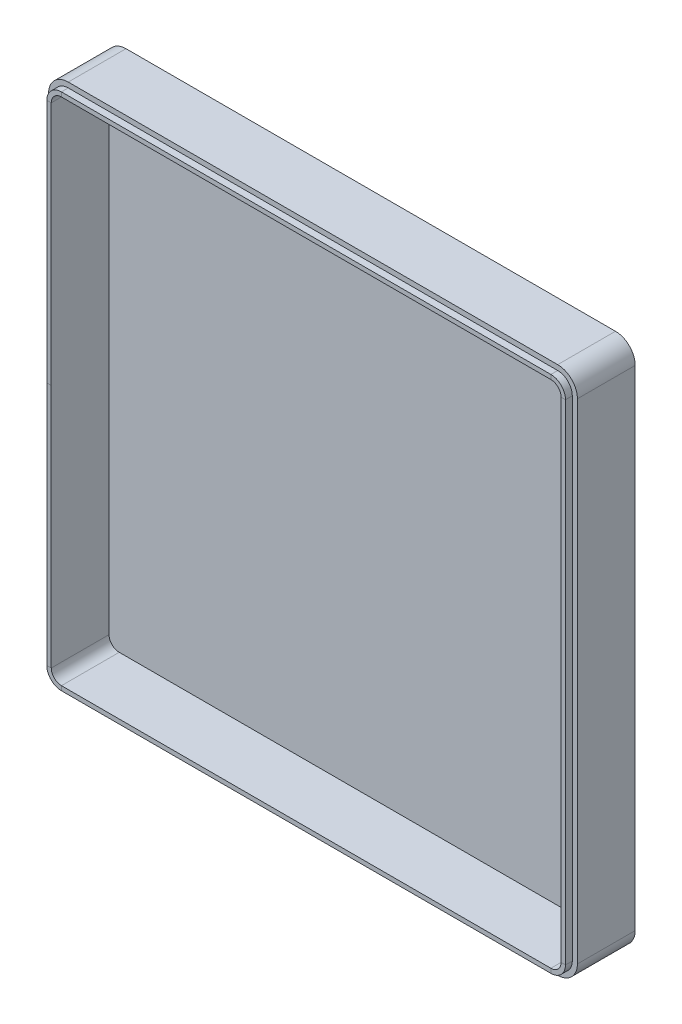
ISO-10303-21;
HEADER;
FILE_DESCRIPTION(('STEP AP214'),'2;1');
FILE_NAME('part.step','',(''),(''),'','','');
FILE_SCHEMA(('AUTOMOTIVE_DESIGN { 1 0 10303 214 1 1 1 1 }'));
ENDSEC;
DATA;
#1=APPLICATION_CONTEXT('core data for automotive mechanical design processes');
#2=APPLICATION_PROTOCOL_DEFINITION('international standard','automotive_design',2000,#1);
#3=PRODUCT_CONTEXT('',#1,'mechanical');
#4=PRODUCT('Part','Part','',(#3));
#5=PRODUCT_RELATED_PRODUCT_CATEGORY('part','',(#4));
#6=PRODUCT_DEFINITION_FORMATION('','',#4);
#7=PRODUCT_DEFINITION_CONTEXT('part definition',#1,'design');
#8=PRODUCT_DEFINITION('design','',#6,#7);
#9=PRODUCT_DEFINITION_SHAPE('','',#8);
#10=(LENGTH_UNIT() NAMED_UNIT(*) SI_UNIT(.MILLI.,.METRE.));
#11=(NAMED_UNIT(*) PLANE_ANGLE_UNIT() SI_UNIT($,.RADIAN.));
#12=(NAMED_UNIT(*) SI_UNIT($,.STERADIAN.) SOLID_ANGLE_UNIT());
#13=UNCERTAINTY_MEASURE_WITH_UNIT(LENGTH_MEASURE(1.E-05),#10,'distance_accuracy_value','');
#14=(GEOMETRIC_REPRESENTATION_CONTEXT(3) GLOBAL_UNCERTAINTY_ASSIGNED_CONTEXT((#13)) GLOBAL_UNIT_ASSIGNED_CONTEXT((#10,
#11,#12)) REPRESENTATION_CONTEXT('',''));
#15=CARTESIAN_POINT('',(0.,0.,0.));
#16=DIRECTION('',(0.,0.,1.));
#17=DIRECTION('',(1.,0.,0.));
#18=AXIS2_PLACEMENT_3D('',#15,#16,#17);
#19=CARTESIAN_POINT('',(-75.,77.8,0.));
#20=DIRECTION('',(0.,1.,0.));
#21=DIRECTION('',(0.,0.,1.));
#22=AXIS2_PLACEMENT_3D('',#19,#20,#21);
#23=PLANE('',#22);
#24=DIRECTION('',(0.,0.,1.));
#25=VECTOR('',#24,1.);
#26=CARTESIAN_POINT('',(72.,77.8,0.));
#27=LINE('',#26,#25);
#28=CARTESIAN_POINT('',(72.,77.8,15.));
#29=VERTEX_POINT('',#28);
#30=CARTESIAN_POINT('',(72.,77.8,-2.));
#31=VERTEX_POINT('',#30);
#32=EDGE_CURVE('E222',#29,#31,#27,.F.);
#33=ORIENTED_EDGE('',*,*,#32,.T.);
#34=DIRECTION('',(1.,0.,0.));
#35=VECTOR('',#34,1.);
#36=CARTESIAN_POINT('',(-72.,77.8,-2.));
#37=LINE('',#36,#35);
#38=CARTESIAN_POINT('',(-72.,77.8,-2.));
#39=VERTEX_POINT('',#38);
#40=EDGE_CURVE('E51',#39,#31,#37,.T.);
#41=ORIENTED_EDGE('',*,*,#40,.F.);
#42=DIRECTION('',(0.,0.,1.));
#43=VECTOR('',#42,1.);
#44=CARTESIAN_POINT('',(-72.,77.8,0.));
#45=LINE('',#44,#43);
#46=CARTESIAN_POINT('',(-72.,77.8,15.));
#47=VERTEX_POINT('',#46);
#48=EDGE_CURVE('E219',#39,#47,#45,.T.);
#49=ORIENTED_EDGE('',*,*,#48,.T.);
#50=DIRECTION('',(1.,0.,0.));
#51=VECTOR('',#50,1.);
#52=CARTESIAN_POINT('',(-75.,77.8,15.));
#53=LINE('',#52,#51);
#54=EDGE_CURVE('E265',#47,#29,#53,.T.);
#55=ORIENTED_EDGE('',*,*,#54,.T.);
#56=EDGE_LOOP('',(#33,#41,#49,#55));
#57=FACE_BOUND('',#56,.T.);
#58=ADVANCED_FACE('F34',(#57),#23,.T.);
#59=CARTESIAN_POINT('',(-77.8,75.,0.));
#60=DIRECTION('',(-1.,0.,0.));
#61=DIRECTION('',(0.,0.,1.));
#62=AXIS2_PLACEMENT_3D('',#59,#60,#61);
#63=PLANE('',#62);
#64=DIRECTION('',(0.,0.,1.));
#65=VECTOR('',#64,1.);
#66=CARTESIAN_POINT('',(-77.8,72.,0.));
#67=LINE('',#66,#65);
#68=CARTESIAN_POINT('',(-77.8,72.,15.));
#69=VERTEX_POINT('',#68);
#70=CARTESIAN_POINT('',(-77.8,72.,-2.));
#71=VERTEX_POINT('',#70);
#72=EDGE_CURVE('E236',#69,#71,#67,.F.);
#73=ORIENTED_EDGE('',*,*,#72,.T.);
#74=DIRECTION('',(0.,1.,0.));
#75=VECTOR('',#74,1.);
#76=CARTESIAN_POINT('',(-77.8,-72.,-2.));
#77=LINE('',#76,#75);
#78=CARTESIAN_POINT('',(-77.8,-72.,-2.));
#79=VERTEX_POINT('',#78);
#80=EDGE_CURVE('E210',#79,#71,#77,.T.);
#81=ORIENTED_EDGE('',*,*,#80,.F.);
#82=DIRECTION('',(0.,0.,1.));
#83=VECTOR('',#82,1.);
#84=CARTESIAN_POINT('',(-77.8,-72.,0.));
#85=LINE('',#84,#83);
#86=CARTESIAN_POINT('',(-77.8,-72.,15.));
#87=VERTEX_POINT('',#86);
#88=EDGE_CURVE('E238',#79,#87,#85,.T.);
#89=ORIENTED_EDGE('',*,*,#88,.T.);
#90=DIRECTION('',(0.,1.,0.));
#91=VECTOR('',#90,1.);
#92=CARTESIAN_POINT('',(-77.8,75.,15.));
#93=LINE('',#92,#91);
#94=EDGE_CURVE('E261',#87,#69,#93,.T.);
#95=ORIENTED_EDGE('',*,*,#94,.T.);
#96=EDGE_LOOP('',(#73,#81,#89,#95));
#97=FACE_BOUND('',#96,.T.);
#98=ADVANCED_FACE('F452',(#97),#63,.T.);
#99=CARTESIAN_POINT('',(-72.,72.,0.));
#100=DIRECTION('',(0.,0.,1.));
#101=DIRECTION('',(1.,0.,0.));
#102=AXIS2_PLACEMENT_3D('',#99,#100,#101);
#103=CYLINDRICAL_SURFACE('',#102,5.8);
#104=ORIENTED_EDGE('',*,*,#48,.F.);
#105=CARTESIAN_POINT('',(-72.,72.,-2.));
#106=DIRECTION('',(0.,0.,-1.));
#107=DIRECTION('',(-1.,0.,0.));
#108=AXIS2_PLACEMENT_3D('',#105,#106,#107);
#109=CIRCLE('',#108,5.8);
#110=EDGE_CURVE('E207',#71,#39,#109,.T.);
#111=ORIENTED_EDGE('',*,*,#110,.F.);
#112=ORIENTED_EDGE('',*,*,#72,.F.);
#113=CARTESIAN_POINT('',(-72.,72.,15.));
#114=DIRECTION('',(0.,0.,1.));
#115=DIRECTION('',(1.,0.,0.));
#116=AXIS2_PLACEMENT_3D('',#113,#114,#115);
#117=CIRCLE('',#116,5.8);
#118=EDGE_CURVE('E225',#69,#47,#117,.F.);
#119=ORIENTED_EDGE('',*,*,#118,.T.);
#120=EDGE_LOOP('',(#104,#111,#112,#119));
#121=FACE_BOUND('',#120,.T.);
#122=ADVANCED_FACE('F36',(#121),#103,.T.);
#123=CARTESIAN_POINT('',(-75.,-77.8,0.));
#124=DIRECTION('',(0.,-1.,0.));
#125=DIRECTION('',(0.,0.,-1.));
#126=AXIS2_PLACEMENT_3D('',#123,#124,#125);
#127=PLANE('',#126);
#128=DIRECTION('',(0.,0.,1.));
#129=VECTOR('',#128,1.);
#130=CARTESIAN_POINT('',(-72.,-77.8,0.));
#131=LINE('',#130,#129);
#132=CARTESIAN_POINT('',(-72.,-77.8,15.));
#133=VERTEX_POINT('',#132);
#134=CARTESIAN_POINT('',(-72.,-77.8,-2.));
#135=VERTEX_POINT('',#134);
#136=EDGE_CURVE('E229',#133,#135,#131,.F.);
#137=ORIENTED_EDGE('',*,*,#136,.T.);
#138=DIRECTION('',(-1.,0.,0.));
#139=VECTOR('',#138,1.);
#140=CARTESIAN_POINT('',(72.,-77.8,-2.));
#141=LINE('',#140,#139);
#142=CARTESIAN_POINT('',(72.,-77.8,-2.));
#143=VERTEX_POINT('',#142);
#144=EDGE_CURVE('E420',#143,#135,#141,.T.);
#145=ORIENTED_EDGE('',*,*,#144,.F.);
#146=DIRECTION('',(0.,0.,1.));
#147=VECTOR('',#146,1.);
#148=CARTESIAN_POINT('',(72.,-77.8,0.));
#149=LINE('',#148,#147);
#150=CARTESIAN_POINT('',(72.,-77.8,15.));
#151=VERTEX_POINT('',#150);
#152=EDGE_CURVE('E234',#143,#151,#149,.T.);
#153=ORIENTED_EDGE('',*,*,#152,.T.);
#154=DIRECTION('',(-1.,0.,0.));
#155=VECTOR('',#154,1.);
#156=CARTESIAN_POINT('',(-75.,-77.8,15.));
#157=LINE('',#156,#155);
#158=EDGE_CURVE('E258',#151,#133,#157,.T.);
#159=ORIENTED_EDGE('',*,*,#158,.T.);
#160=EDGE_LOOP('',(#137,#145,#153,#159));
#161=FACE_BOUND('',#160,.T.);
#162=ADVANCED_FACE('F445',(#161),#127,.T.);
#163=CARTESIAN_POINT('',(-72.,-72.,0.));
#164=DIRECTION('',(0.,0.,1.));
#165=DIRECTION('',(1.,0.,0.));
#166=AXIS2_PLACEMENT_3D('',#163,#164,#165);
#167=CYLINDRICAL_SURFACE('',#166,5.8);
#168=ORIENTED_EDGE('',*,*,#88,.F.);
#169=CARTESIAN_POINT('',(-72.,-72.,-2.));
#170=DIRECTION('',(0.,0.,-1.));
#171=DIRECTION('',(-1.,0.,0.));
#172=AXIS2_PLACEMENT_3D('',#169,#170,#171);
#173=CIRCLE('',#172,5.8);
#174=EDGE_CURVE('E418',#135,#79,#173,.T.);
#175=ORIENTED_EDGE('',*,*,#174,.F.);
#176=ORIENTED_EDGE('',*,*,#136,.F.);
#177=CARTESIAN_POINT('',(-72.,-72.,15.));
#178=DIRECTION('',(0.,0.,1.));
#179=DIRECTION('',(1.,0.,0.));
#180=AXIS2_PLACEMENT_3D('',#177,#178,#179);
#181=CIRCLE('',#180,5.8);
#182=EDGE_CURVE('E276',#133,#87,#181,.F.);
#183=ORIENTED_EDGE('',*,*,#182,.T.);
#184=EDGE_LOOP('',(#168,#175,#176,#183));
#185=FACE_BOUND('',#184,.T.);
#186=ADVANCED_FACE('F449',(#185),#167,.T.);
#187=CARTESIAN_POINT('',(77.8,75.,0.));
#188=DIRECTION('',(1.,0.,0.));
#189=DIRECTION('',(0.,1.,0.));
#190=AXIS2_PLACEMENT_3D('',#187,#188,#189);
#191=PLANE('',#190);
#192=DIRECTION('',(0.,0.,1.));
#193=VECTOR('',#192,1.);
#194=CARTESIAN_POINT('',(77.8,-72.,0.));
#195=LINE('',#194,#193);
#196=CARTESIAN_POINT('',(77.8,-72.,15.));
#197=VERTEX_POINT('',#196);
#198=CARTESIAN_POINT('',(77.8,-72.,-2.));
#199=VERTEX_POINT('',#198);
#200=EDGE_CURVE('E38',#197,#199,#195,.F.);
#201=ORIENTED_EDGE('',*,*,#200,.T.);
#202=DIRECTION('',(0.,-1.,0.));
#203=VECTOR('',#202,1.);
#204=CARTESIAN_POINT('',(77.8,72.,-2.));
#205=LINE('',#204,#203);
#206=CARTESIAN_POINT('',(77.8,72.,-2.));
#207=VERTEX_POINT('',#206);
#208=EDGE_CURVE('E424',#207,#199,#205,.T.);
#209=ORIENTED_EDGE('',*,*,#208,.F.);
#210=DIRECTION('',(0.,0.,1.));
#211=VECTOR('',#210,1.);
#212=CARTESIAN_POINT('',(77.8,72.,0.));
#213=LINE('',#212,#211);
#214=CARTESIAN_POINT('',(77.8,72.,15.));
#215=VERTEX_POINT('',#214);
#216=EDGE_CURVE('E227',#207,#215,#213,.T.);
#217=ORIENTED_EDGE('',*,*,#216,.T.);
#218=DIRECTION('',(0.,-1.,0.));
#219=VECTOR('',#218,1.);
#220=CARTESIAN_POINT('',(77.8,75.,15.));
#221=LINE('',#220,#219);
#222=EDGE_CURVE('E267',#215,#197,#221,.T.);
#223=ORIENTED_EDGE('',*,*,#222,.T.);
#224=EDGE_LOOP('',(#201,#209,#217,#223));
#225=FACE_BOUND('',#224,.T.);
#226=ADVANCED_FACE('F432',(#225),#191,.T.);
#227=CARTESIAN_POINT('',(72.,-72.,0.));
#228=DIRECTION('',(0.,0.,1.));
#229=DIRECTION('',(1.,0.,0.));
#230=AXIS2_PLACEMENT_3D('',#227,#228,#229);
#231=CYLINDRICAL_SURFACE('',#230,5.8);
#232=ORIENTED_EDGE('',*,*,#152,.F.);
#233=CARTESIAN_POINT('',(72.,-72.,-2.));
#234=DIRECTION('',(0.,0.,-1.));
#235=DIRECTION('',(-1.,0.,0.));
#236=AXIS2_PLACEMENT_3D('',#233,#234,#235);
#237=CIRCLE('',#236,5.8);
#238=EDGE_CURVE('E422',#199,#143,#237,.T.);
#239=ORIENTED_EDGE('',*,*,#238,.F.);
#240=ORIENTED_EDGE('',*,*,#200,.F.);
#241=CARTESIAN_POINT('',(72.,-72.,15.));
#242=DIRECTION('',(0.,0.,1.));
#243=DIRECTION('',(1.,0.,0.));
#244=AXIS2_PLACEMENT_3D('',#241,#242,#243);
#245=CIRCLE('',#244,5.8);
#246=EDGE_CURVE('E273',#197,#151,#245,.F.);
#247=ORIENTED_EDGE('',*,*,#246,.T.);
#248=EDGE_LOOP('',(#232,#239,#240,#247));
#249=FACE_BOUND('',#248,.T.);
#250=ADVANCED_FACE('F441',(#249),#231,.T.);
#251=CARTESIAN_POINT('',(72.,72.,0.));
#252=DIRECTION('',(0.,0.,1.));
#253=DIRECTION('',(1.,0.,0.));
#254=AXIS2_PLACEMENT_3D('',#251,#252,#253);
#255=CYLINDRICAL_SURFACE('',#254,5.8);
#256=ORIENTED_EDGE('',*,*,#216,.F.);
#257=CARTESIAN_POINT('',(72.,72.,-2.));
#258=DIRECTION('',(0.,0.,-1.));
#259=DIRECTION('',(-1.,0.,0.));
#260=AXIS2_PLACEMENT_3D('',#257,#258,#259);
#261=CIRCLE('',#260,5.8);
#262=EDGE_CURVE('E223',#31,#207,#261,.T.);
#263=ORIENTED_EDGE('',*,*,#262,.F.);
#264=ORIENTED_EDGE('',*,*,#32,.F.);
#265=CARTESIAN_POINT('',(72.,72.,15.));
#266=DIRECTION('',(0.,0.,1.));
#267=DIRECTION('',(1.,0.,0.));
#268=AXIS2_PLACEMENT_3D('',#265,#266,#267);
#269=CIRCLE('',#268,5.8);
#270=EDGE_CURVE('E270',#29,#215,#269,.F.);
#271=ORIENTED_EDGE('',*,*,#270,.T.);
#272=EDGE_LOOP('',(#256,#263,#264,#271));
#273=FACE_BOUND('',#272,.T.);
#274=ADVANCED_FACE('F434',(#273),#255,.T.);
#275=CARTESIAN_POINT('',(0.,0.,15.));
#276=DIRECTION('',(0.,0.,1.));
#277=DIRECTION('',(1.,0.,0.));
#278=AXIS2_PLACEMENT_3D('',#275,#276,#277);
#279=PLANE('',#278);
#280=DIRECTION('',(0.,1.,0.));
#281=VECTOR('',#280,1.);
#282=CARTESIAN_POINT('',(-76.3,-72.,15.));
#283=LINE('',#282,#281);
#284=CARTESIAN_POINT('',(-76.3,-72.,15.));
#285=VERTEX_POINT('',#284);
#286=CARTESIAN_POINT('',(-76.3,0.,15.));
#287=VERTEX_POINT('',#286);
#288=EDGE_CURVE('E340',#285,#287,#283,.T.);
#289=ORIENTED_EDGE('',*,*,#288,.T.);
#290=DIRECTION('',(0.,1.,0.));
#291=VECTOR('',#290,1.);
#292=CARTESIAN_POINT('',(-76.3,0.,15.));
#293=LINE('',#292,#291);
#294=CARTESIAN_POINT('',(-76.3,72.,15.));
#295=VERTEX_POINT('',#294);
#296=EDGE_CURVE('E386',#287,#295,#293,.T.);
#297=ORIENTED_EDGE('',*,*,#296,.T.);
#298=CARTESIAN_POINT('',(-72.,72.,15.));
#299=DIRECTION('',(0.,0.,-1.));
#300=DIRECTION('',(-1.,0.,0.));
#301=AXIS2_PLACEMENT_3D('',#298,#299,#300);
#302=CIRCLE('',#301,4.3);
#303=CARTESIAN_POINT('',(-72.,76.3,15.));
#304=VERTEX_POINT('',#303);
#305=EDGE_CURVE('E380',#295,#304,#302,.T.);
#306=ORIENTED_EDGE('',*,*,#305,.T.);
#307=DIRECTION('',(1.,0.,0.));
#308=VECTOR('',#307,1.);
#309=CARTESIAN_POINT('',(-72.,76.3,15.));
#310=LINE('',#309,#308);
#311=CARTESIAN_POINT('',(72.,76.3,15.));
#312=VERTEX_POINT('',#311);
#313=EDGE_CURVE('E374',#304,#312,#310,.T.);
#314=ORIENTED_EDGE('',*,*,#313,.T.);
#315=CARTESIAN_POINT('',(72.,72.,15.));
#316=DIRECTION('',(0.,0.,-1.));
#317=DIRECTION('',(0.,1.,0.));
#318=AXIS2_PLACEMENT_3D('',#315,#316,#317);
#319=CIRCLE('',#318,4.3);
#320=CARTESIAN_POINT('',(76.3,72.,15.));
#321=VERTEX_POINT('',#320);
#322=EDGE_CURVE('E368',#312,#321,#319,.T.);
#323=ORIENTED_EDGE('',*,*,#322,.T.);
#324=DIRECTION('',(0.,-1.,0.));
#325=VECTOR('',#324,1.);
#326=CARTESIAN_POINT('',(76.3,72.,15.));
#327=LINE('',#326,#325);
#328=CARTESIAN_POINT('',(76.3,-72.,15.));
#329=VERTEX_POINT('',#328);
#330=EDGE_CURVE('E360',#321,#329,#327,.T.);
#331=ORIENTED_EDGE('',*,*,#330,.T.);
#332=CARTESIAN_POINT('',(72.,-72.,15.));
#333=DIRECTION('',(0.,0.,-1.));
#334=DIRECTION('',(1.,0.,0.));
#335=AXIS2_PLACEMENT_3D('',#332,#333,#334);
#336=CIRCLE('',#335,4.3);
#337=CARTESIAN_POINT('',(72.,-76.3,15.));
#338=VERTEX_POINT('',#337);
#339=EDGE_CURVE('E357',#329,#338,#336,.T.);
#340=ORIENTED_EDGE('',*,*,#339,.T.);
#341=DIRECTION('',(-1.,0.,0.));
#342=VECTOR('',#341,1.);
#343=CARTESIAN_POINT('',(72.,-76.3,15.));
#344=LINE('',#343,#342);
#345=CARTESIAN_POINT('',(-72.,-76.3,15.));
#346=VERTEX_POINT('',#345);
#347=EDGE_CURVE('E351',#338,#346,#344,.T.);
#348=ORIENTED_EDGE('',*,*,#347,.T.);
#349=CARTESIAN_POINT('',(-72.,-72.,15.));
#350=DIRECTION('',(0.,0.,-1.));
#351=DIRECTION('',(0.,-1.,0.));
#352=AXIS2_PLACEMENT_3D('',#349,#350,#351);
#353=CIRCLE('',#352,4.3);
#354=EDGE_CURVE('E59',#346,#285,#353,.T.);
#355=ORIENTED_EDGE('',*,*,#354,.T.);
#356=EDGE_LOOP('',(#289,#297,#306,#314,#323,#331,#340,#348,#355));
#357=FACE_BOUND('',#356,.T.);
#358=ORIENTED_EDGE('',*,*,#246,.F.);
#359=ORIENTED_EDGE('',*,*,#222,.F.);
#360=ORIENTED_EDGE('',*,*,#270,.F.);
#361=ORIENTED_EDGE('',*,*,#54,.F.);
#362=ORIENTED_EDGE('',*,*,#118,.F.);
#363=ORIENTED_EDGE('',*,*,#94,.F.);
#364=ORIENTED_EDGE('',*,*,#182,.F.);
#365=ORIENTED_EDGE('',*,*,#158,.F.);
#366=EDGE_LOOP('',(#358,#359,#360,#361,#362,#363,#364,#365));
#367=FACE_BOUND('',#366,.T.);
#368=ADVANCED_FACE('F437',(#357,#367),#279,.T.);
#369=CARTESIAN_POINT('',(-76.3,-72.,17.));
#370=DIRECTION('',(0.,0.,1.));
#371=DIRECTION('',(1.,0.,0.));
#372=AXIS2_PLACEMENT_3D('',#369,#370,#371);
#373=PLANE('',#372);
#374=DIRECTION('',(0.,1.,0.));
#375=VECTOR('',#374,1.);
#376=CARTESIAN_POINT('',(-76.3,-72.,17.));
#377=LINE('',#376,#375);
#378=CARTESIAN_POINT('',(-76.3,-72.,17.));
#379=VERTEX_POINT('',#378);
#380=CARTESIAN_POINT('',(-76.3,0.,17.));
#381=VERTEX_POINT('',#380);
#382=EDGE_CURVE('E262',#379,#381,#377,.T.);
#383=ORIENTED_EDGE('',*,*,#382,.F.);
#384=DIRECTION('',(1.,0.,0.));
#385=VECTOR('',#384,1.);
#386=CARTESIAN_POINT('',(-76.3,-72.,17.));
#387=LINE('',#386,#385);
#388=CARTESIAN_POINT('',(-75.,-72.,17.));
#389=VERTEX_POINT('',#388);
#390=EDGE_CURVE('E294',#379,#389,#387,.T.);
#391=ORIENTED_EDGE('',*,*,#390,.T.);
#392=DIRECTION('',(0.,1.,0.));
#393=VECTOR('',#392,1.);
#394=CARTESIAN_POINT('',(-75.,-72.,17.));
#395=LINE('',#394,#393);
#396=CARTESIAN_POINT('',(-75.,0.,17.));
#397=VERTEX_POINT('',#396);
#398=EDGE_CURVE('E297',#389,#397,#395,.T.);
#399=ORIENTED_EDGE('',*,*,#398,.T.);
#400=DIRECTION('',(1.,0.,0.));
#401=VECTOR('',#400,1.);
#402=CARTESIAN_POINT('',(-76.3,0.,17.));
#403=LINE('',#402,#401);
#404=EDGE_CURVE('E334',#381,#397,#403,.T.);
#405=ORIENTED_EDGE('',*,*,#404,.F.);
#406=EDGE_LOOP('',(#383,#391,#399,#405));
#407=FACE_BOUND('',#406,.T.);
#408=ADVANCED_FACE('F496',(#407),#373,.T.);
#409=CARTESIAN_POINT('',(-76.3,-72.,17.));
#410=DIRECTION('',(-1.,0.,0.));
#411=DIRECTION('',(0.,0.,1.));
#412=AXIS2_PLACEMENT_3D('',#409,#410,#411);
#413=PLANE('',#412);
#414=ORIENTED_EDGE('',*,*,#288,.F.);
#415=DIRECTION('',(0.,0.,1.));
#416=VECTOR('',#415,1.);
#417=CARTESIAN_POINT('',(-76.3,-72.,17.));
#418=LINE('',#417,#416);
#419=EDGE_CURVE('E343',#285,#379,#418,.T.);
#420=ORIENTED_EDGE('',*,*,#419,.T.);
#421=ORIENTED_EDGE('',*,*,#382,.T.);
#422=DIRECTION('',(0.,0.,1.));
#423=VECTOR('',#422,1.);
#424=CARTESIAN_POINT('',(-76.3,0.,17.));
#425=LINE('',#424,#423);
#426=EDGE_CURVE('E338',#287,#381,#425,.T.);
#427=ORIENTED_EDGE('',*,*,#426,.F.);
#428=EDGE_LOOP('',(#414,#420,#421,#427));
#429=FACE_BOUND('',#428,.T.);
#430=ADVANCED_FACE('F504',(#429),#413,.T.);
#431=CARTESIAN_POINT('',(-72.,-76.3,17.));
#432=DIRECTION('',(0.,0.,1.));
#433=DIRECTION('',(1.,0.,0.));
#434=AXIS2_PLACEMENT_3D('',#431,#432,#433);
#435=PLANE('',#434);
#436=ORIENTED_EDGE('',*,*,#390,.F.);
#437=CARTESIAN_POINT('',(-72.,-72.,17.));
#438=DIRECTION('',(0.,0.,-1.));
#439=DIRECTION('',(0.,-1.,0.));
#440=AXIS2_PLACEMENT_3D('',#437,#438,#439);
#441=CIRCLE('',#440,4.3);
#442=CARTESIAN_POINT('',(-72.,-76.3,17.));
#443=VERTEX_POINT('',#442);
#444=EDGE_CURVE('E298',#443,#379,#441,.T.);
#445=ORIENTED_EDGE('',*,*,#444,.F.);
#446=DIRECTION('',(0.,1.,0.));
#447=VECTOR('',#446,1.);
#448=CARTESIAN_POINT('',(-72.,-76.3,17.));
#449=LINE('',#448,#447);
#450=CARTESIAN_POINT('',(-72.,-75.,17.));
#451=VERTEX_POINT('',#450);
#452=EDGE_CURVE('E299',#443,#451,#449,.T.);
#453=ORIENTED_EDGE('',*,*,#452,.T.);
#454=CARTESIAN_POINT('',(-72.,-72.,17.));
#455=DIRECTION('',(0.,0.,-1.));
#456=DIRECTION('',(0.,-1.,0.));
#457=AXIS2_PLACEMENT_3D('',#454,#455,#456);
#458=CIRCLE('',#457,3.);
#459=EDGE_CURVE('E302',#451,#389,#458,.T.);
#460=ORIENTED_EDGE('',*,*,#459,.T.);
#461=EDGE_LOOP('',(#436,#445,#453,#460));
#462=FACE_BOUND('',#461,.T.);
#463=ADVANCED_FACE('F512',(#462),#435,.T.);
#464=CARTESIAN_POINT('',(-72.,-72.,15.));
#465=DIRECTION('',(0.,0.,-1.));
#466=DIRECTION('',(-1.,0.,0.));
#467=AXIS2_PLACEMENT_3D('',#464,#465,#466);
#468=CYLINDRICAL_SURFACE('',#467,4.3);
#469=ORIENTED_EDGE('',*,*,#444,.T.);
#470=ORIENTED_EDGE('',*,*,#419,.F.);
#471=ORIENTED_EDGE('',*,*,#354,.F.);
#472=DIRECTION('',(0.,0.,1.));
#473=VECTOR('',#472,1.);
#474=CARTESIAN_POINT('',(-72.,-76.3,17.));
#475=LINE('',#474,#473);
#476=EDGE_CURVE('E348',#346,#443,#475,.T.);
#477=ORIENTED_EDGE('',*,*,#476,.T.);
#478=EDGE_LOOP('',(#469,#470,#471,#477));
#479=FACE_BOUND('',#478,.T.);
#480=ADVANCED_FACE('F520',(#479),#468,.T.);
#481=CARTESIAN_POINT('',(72.,-76.3,17.));
#482=DIRECTION('',(0.,0.,1.));
#483=DIRECTION('',(1.,0.,0.));
#484=AXIS2_PLACEMENT_3D('',#481,#482,#483);
#485=PLANE('',#484);
#486=ORIENTED_EDGE('',*,*,#452,.F.);
#487=DIRECTION('',(-1.,0.,0.));
#488=VECTOR('',#487,1.);
#489=CARTESIAN_POINT('',(72.,-76.3,17.));
#490=LINE('',#489,#488);
#491=CARTESIAN_POINT('',(72.,-76.3,17.));
#492=VERTEX_POINT('',#491);
#493=EDGE_CURVE('E303',#492,#443,#490,.T.);
#494=ORIENTED_EDGE('',*,*,#493,.F.);
#495=DIRECTION('',(0.,1.,0.));
#496=VECTOR('',#495,1.);
#497=CARTESIAN_POINT('',(72.,-76.3,17.));
#498=LINE('',#497,#496);
#499=CARTESIAN_POINT('',(72.,-75.,17.));
#500=VERTEX_POINT('',#499);
#501=EDGE_CURVE('E304',#492,#500,#498,.T.);
#502=ORIENTED_EDGE('',*,*,#501,.T.);
#503=DIRECTION('',(-1.,0.,0.));
#504=VECTOR('',#503,1.);
#505=CARTESIAN_POINT('',(72.,-75.,17.));
#506=LINE('',#505,#504);
#507=EDGE_CURVE('E307',#500,#451,#506,.T.);
#508=ORIENTED_EDGE('',*,*,#507,.T.);
#509=EDGE_LOOP('',(#486,#494,#502,#508));
#510=FACE_BOUND('',#509,.T.);
#511=ADVANCED_FACE('F528',(#510),#485,.T.);
#512=CARTESIAN_POINT('',(72.,-76.3,17.));
#513=DIRECTION('',(0.,-1.,0.));
#514=DIRECTION('',(0.,0.,-1.));
#515=AXIS2_PLACEMENT_3D('',#512,#513,#514);
#516=PLANE('',#515);
#517=ORIENTED_EDGE('',*,*,#493,.T.);
#518=ORIENTED_EDGE('',*,*,#476,.F.);
#519=ORIENTED_EDGE('',*,*,#347,.F.);
#520=DIRECTION('',(0.,0.,1.));
#521=VECTOR('',#520,1.);
#522=CARTESIAN_POINT('',(72.,-76.3,17.));
#523=LINE('',#522,#521);
#524=EDGE_CURVE('E354',#338,#492,#523,.T.);
#525=ORIENTED_EDGE('',*,*,#524,.T.);
#526=EDGE_LOOP('',(#517,#518,#519,#525));
#527=FACE_BOUND('',#526,.T.);
#528=ADVANCED_FACE('F536',(#527),#516,.T.);
#529=CARTESIAN_POINT('',(76.3,-72.,17.));
#530=DIRECTION('',(0.,0.,1.));
#531=DIRECTION('',(1.,0.,0.));
#532=AXIS2_PLACEMENT_3D('',#529,#530,#531);
#533=PLANE('',#532);
#534=ORIENTED_EDGE('',*,*,#501,.F.);
#535=CARTESIAN_POINT('',(72.,-72.,17.));
#536=DIRECTION('',(0.,0.,-1.));
#537=DIRECTION('',(1.,0.,0.));
#538=AXIS2_PLACEMENT_3D('',#535,#536,#537);
#539=CIRCLE('',#538,4.3);
#540=CARTESIAN_POINT('',(76.3,-72.,17.));
#541=VERTEX_POINT('',#540);
#542=EDGE_CURVE('E308',#541,#492,#539,.T.);
#543=ORIENTED_EDGE('',*,*,#542,.F.);
#544=DIRECTION('',(-1.,0.,0.));
#545=VECTOR('',#544,1.);
#546=CARTESIAN_POINT('',(76.3,-72.,17.));
#547=LINE('',#546,#545);
#548=CARTESIAN_POINT('',(75.,-72.,17.));
#549=VERTEX_POINT('',#548);
#550=EDGE_CURVE('E309',#541,#549,#547,.T.);
#551=ORIENTED_EDGE('',*,*,#550,.T.);
#552=CARTESIAN_POINT('',(72.,-72.,17.));
#553=DIRECTION('',(0.,0.,-1.));
#554=DIRECTION('',(1.,0.,0.));
#555=AXIS2_PLACEMENT_3D('',#552,#553,#554);
#556=CIRCLE('',#555,3.);
#557=EDGE_CURVE('E312',#549,#500,#556,.T.);
#558=ORIENTED_EDGE('',*,*,#557,.T.);
#559=EDGE_LOOP('',(#534,#543,#551,#558));
#560=FACE_BOUND('',#559,.T.);
#561=ADVANCED_FACE('F544',(#560),#533,.T.);
#562=CARTESIAN_POINT('',(72.,-72.,15.));
#563=DIRECTION('',(0.,0.,-1.));
#564=DIRECTION('',(-1.,0.,0.));
#565=AXIS2_PLACEMENT_3D('',#562,#563,#564);
#566=CYLINDRICAL_SURFACE('',#565,4.3);
#567=ORIENTED_EDGE('',*,*,#542,.T.);
#568=ORIENTED_EDGE('',*,*,#524,.F.);
#569=ORIENTED_EDGE('',*,*,#339,.F.);
#570=DIRECTION('',(0.,0.,1.));
#571=VECTOR('',#570,1.);
#572=CARTESIAN_POINT('',(76.3,-72.,17.));
#573=LINE('',#572,#571);
#574=EDGE_CURVE('E313',#329,#541,#573,.T.);
#575=ORIENTED_EDGE('',*,*,#574,.T.);
#576=EDGE_LOOP('',(#567,#568,#569,#575));
#577=FACE_BOUND('',#576,.T.);
#578=ADVANCED_FACE('F552',(#577),#566,.T.);
#579=CARTESIAN_POINT('',(76.3,72.,17.));
#580=DIRECTION('',(0.,0.,1.));
#581=DIRECTION('',(1.,0.,0.));
#582=AXIS2_PLACEMENT_3D('',#579,#580,#581);
#583=PLANE('',#582);
#584=ORIENTED_EDGE('',*,*,#550,.F.);
#585=DIRECTION('',(0.,-1.,0.));
#586=VECTOR('',#585,1.);
#587=CARTESIAN_POINT('',(76.3,72.,17.));
#588=LINE('',#587,#586);
#589=CARTESIAN_POINT('',(76.3,72.,17.));
#590=VERTEX_POINT('',#589);
#591=EDGE_CURVE('E358',#590,#541,#588,.T.);
#592=ORIENTED_EDGE('',*,*,#591,.F.);
#593=DIRECTION('',(-1.,0.,0.));
#594=VECTOR('',#593,1.);
#595=CARTESIAN_POINT('',(76.3,72.,17.));
#596=LINE('',#595,#594);
#597=CARTESIAN_POINT('',(75.,72.,17.));
#598=VERTEX_POINT('',#597);
#599=EDGE_CURVE('E314',#590,#598,#596,.T.);
#600=ORIENTED_EDGE('',*,*,#599,.T.);
#601=DIRECTION('',(0.,-1.,0.));
#602=VECTOR('',#601,1.);
#603=CARTESIAN_POINT('',(75.,72.,17.));
#604=LINE('',#603,#602);
#605=EDGE_CURVE('E317',#598,#549,#604,.T.);
#606=ORIENTED_EDGE('',*,*,#605,.T.);
#607=EDGE_LOOP('',(#584,#592,#600,#606));
#608=FACE_BOUND('',#607,.T.);
#609=ADVANCED_FACE('F560',(#608),#583,.T.);
#610=CARTESIAN_POINT('',(76.3,72.,17.));
#611=DIRECTION('',(1.,0.,0.));
#612=DIRECTION('',(0.,1.,0.));
#613=AXIS2_PLACEMENT_3D('',#610,#611,#612);
#614=PLANE('',#613);
#615=ORIENTED_EDGE('',*,*,#591,.T.);
#616=ORIENTED_EDGE('',*,*,#574,.F.);
#617=ORIENTED_EDGE('',*,*,#330,.F.);
#618=DIRECTION('',(0.,0.,1.));
#619=VECTOR('',#618,1.);
#620=CARTESIAN_POINT('',(76.3,72.,17.));
#621=LINE('',#620,#619);
#622=EDGE_CURVE('E365',#321,#590,#621,.T.);
#623=ORIENTED_EDGE('',*,*,#622,.T.);
#624=EDGE_LOOP('',(#615,#616,#617,#623));
#625=FACE_BOUND('',#624,.T.);
#626=ADVANCED_FACE('F568',(#625),#614,.T.);
#627=CARTESIAN_POINT('',(72.,76.3,17.));
#628=DIRECTION('',(0.,0.,1.));
#629=DIRECTION('',(1.,0.,0.));
#630=AXIS2_PLACEMENT_3D('',#627,#628,#629);
#631=PLANE('',#630);
#632=ORIENTED_EDGE('',*,*,#599,.F.);
#633=CARTESIAN_POINT('',(72.,72.,17.));
#634=DIRECTION('',(0.,0.,-1.));
#635=DIRECTION('',(0.,1.,0.));
#636=AXIS2_PLACEMENT_3D('',#633,#634,#635);
#637=CIRCLE('',#636,4.3);
#638=CARTESIAN_POINT('',(72.,76.3,17.));
#639=VERTEX_POINT('',#638);
#640=EDGE_CURVE('E318',#639,#590,#637,.T.);
#641=ORIENTED_EDGE('',*,*,#640,.F.);
#642=DIRECTION('',(0.,-1.,0.));
#643=VECTOR('',#642,1.);
#644=CARTESIAN_POINT('',(72.,76.3,17.));
#645=LINE('',#644,#643);
#646=CARTESIAN_POINT('',(72.,75.,17.));
#647=VERTEX_POINT('',#646);
#648=EDGE_CURVE('E319',#639,#647,#645,.T.);
#649=ORIENTED_EDGE('',*,*,#648,.T.);
#650=CARTESIAN_POINT('',(72.,72.,17.));
#651=DIRECTION('',(0.,0.,-1.));
#652=DIRECTION('',(0.,1.,0.));
#653=AXIS2_PLACEMENT_3D('',#650,#651,#652);
#654=CIRCLE('',#653,3.);
#655=EDGE_CURVE('E322',#647,#598,#654,.T.);
#656=ORIENTED_EDGE('',*,*,#655,.T.);
#657=EDGE_LOOP('',(#632,#641,#649,#656));
#658=FACE_BOUND('',#657,.T.);
#659=ADVANCED_FACE('F576',(#658),#631,.T.);
#660=CARTESIAN_POINT('',(72.,72.,15.));
#661=DIRECTION('',(0.,0.,-1.));
#662=DIRECTION('',(-1.,0.,0.));
#663=AXIS2_PLACEMENT_3D('',#660,#661,#662);
#664=CYLINDRICAL_SURFACE('',#663,4.3);
#665=ORIENTED_EDGE('',*,*,#640,.T.);
#666=ORIENTED_EDGE('',*,*,#622,.F.);
#667=ORIENTED_EDGE('',*,*,#322,.F.);
#668=DIRECTION('',(0.,0.,1.));
#669=VECTOR('',#668,1.);
#670=CARTESIAN_POINT('',(72.,76.3,17.));
#671=LINE('',#670,#669);
#672=EDGE_CURVE('E371',#312,#639,#671,.T.);
#673=ORIENTED_EDGE('',*,*,#672,.T.);
#674=EDGE_LOOP('',(#665,#666,#667,#673));
#675=FACE_BOUND('',#674,.T.);
#676=ADVANCED_FACE('F584',(#675),#664,.T.);
#677=CARTESIAN_POINT('',(-72.,76.3,17.));
#678=DIRECTION('',(0.,0.,1.));
#679=DIRECTION('',(1.,0.,0.));
#680=AXIS2_PLACEMENT_3D('',#677,#678,#679);
#681=PLANE('',#680);
#682=ORIENTED_EDGE('',*,*,#648,.F.);
#683=DIRECTION('',(1.,0.,0.));
#684=VECTOR('',#683,1.);
#685=CARTESIAN_POINT('',(-72.,76.3,17.));
#686=LINE('',#685,#684);
#687=CARTESIAN_POINT('',(-72.,76.3,17.));
#688=VERTEX_POINT('',#687);
#689=EDGE_CURVE('E323',#688,#639,#686,.T.);
#690=ORIENTED_EDGE('',*,*,#689,.F.);
#691=DIRECTION('',(0.,-1.,0.));
#692=VECTOR('',#691,1.);
#693=CARTESIAN_POINT('',(-72.,76.3,17.));
#694=LINE('',#693,#692);
#695=CARTESIAN_POINT('',(-72.,75.,17.));
#696=VERTEX_POINT('',#695);
#697=EDGE_CURVE('E324',#688,#696,#694,.T.);
#698=ORIENTED_EDGE('',*,*,#697,.T.);
#699=DIRECTION('',(1.,0.,0.));
#700=VECTOR('',#699,1.);
#701=CARTESIAN_POINT('',(-72.,75.,17.));
#702=LINE('',#701,#700);
#703=EDGE_CURVE('E327',#696,#647,#702,.T.);
#704=ORIENTED_EDGE('',*,*,#703,.T.);
#705=EDGE_LOOP('',(#682,#690,#698,#704));
#706=FACE_BOUND('',#705,.T.);
#707=ADVANCED_FACE('F592',(#706),#681,.T.);
#708=CARTESIAN_POINT('',(-72.,76.3,17.));
#709=DIRECTION('',(0.,1.,0.));
#710=DIRECTION('',(0.,0.,1.));
#711=AXIS2_PLACEMENT_3D('',#708,#709,#710);
#712=PLANE('',#711);
#713=ORIENTED_EDGE('',*,*,#689,.T.);
#714=ORIENTED_EDGE('',*,*,#672,.F.);
#715=ORIENTED_EDGE('',*,*,#313,.F.);
#716=DIRECTION('',(0.,0.,1.));
#717=VECTOR('',#716,1.);
#718=CARTESIAN_POINT('',(-72.,76.3,17.));
#719=LINE('',#718,#717);
#720=EDGE_CURVE('E377',#304,#688,#719,.T.);
#721=ORIENTED_EDGE('',*,*,#720,.T.);
#722=EDGE_LOOP('',(#713,#714,#715,#721));
#723=FACE_BOUND('',#722,.T.);
#724=ADVANCED_FACE('F600',(#723),#712,.T.);
#725=CARTESIAN_POINT('',(-76.3,72.,17.));
#726=DIRECTION('',(0.,0.,1.));
#727=DIRECTION('',(1.,0.,0.));
#728=AXIS2_PLACEMENT_3D('',#725,#726,#727);
#729=PLANE('',#728);
#730=ORIENTED_EDGE('',*,*,#697,.F.);
#731=CARTESIAN_POINT('',(-72.,72.,17.));
#732=DIRECTION('',(0.,0.,-1.));
#733=DIRECTION('',(-1.,0.,0.));
#734=AXIS2_PLACEMENT_3D('',#731,#732,#733);
#735=CIRCLE('',#734,4.3);
#736=CARTESIAN_POINT('',(-76.3,72.,17.));
#737=VERTEX_POINT('',#736);
#738=EDGE_CURVE('E328',#737,#688,#735,.T.);
#739=ORIENTED_EDGE('',*,*,#738,.F.);
#740=DIRECTION('',(1.,0.,0.));
#741=VECTOR('',#740,1.);
#742=CARTESIAN_POINT('',(-76.3,72.,17.));
#743=LINE('',#742,#741);
#744=CARTESIAN_POINT('',(-75.,72.,17.));
#745=VERTEX_POINT('',#744);
#746=EDGE_CURVE('E329',#737,#745,#743,.T.);
#747=ORIENTED_EDGE('',*,*,#746,.T.);
#748=CARTESIAN_POINT('',(-72.,72.,17.));
#749=DIRECTION('',(0.,0.,-1.));
#750=DIRECTION('',(-1.,0.,0.));
#751=AXIS2_PLACEMENT_3D('',#748,#749,#750);
#752=CIRCLE('',#751,3.);
#753=EDGE_CURVE('E332',#745,#696,#752,.T.);
#754=ORIENTED_EDGE('',*,*,#753,.T.);
#755=EDGE_LOOP('',(#730,#739,#747,#754));
#756=FACE_BOUND('',#755,.T.);
#757=ADVANCED_FACE('F608',(#756),#729,.T.);
#758=CARTESIAN_POINT('',(-72.,72.,15.));
#759=DIRECTION('',(0.,0.,-1.));
#760=DIRECTION('',(-1.,0.,0.));
#761=AXIS2_PLACEMENT_3D('',#758,#759,#760);
#762=CYLINDRICAL_SURFACE('',#761,4.3);
#763=ORIENTED_EDGE('',*,*,#738,.T.);
#764=ORIENTED_EDGE('',*,*,#720,.F.);
#765=ORIENTED_EDGE('',*,*,#305,.F.);
#766=DIRECTION('',(0.,0.,1.));
#767=VECTOR('',#766,1.);
#768=CARTESIAN_POINT('',(-76.3,72.,17.));
#769=LINE('',#768,#767);
#770=EDGE_CURVE('E383',#295,#737,#769,.T.);
#771=ORIENTED_EDGE('',*,*,#770,.T.);
#772=EDGE_LOOP('',(#763,#764,#765,#771));
#773=FACE_BOUND('',#772,.T.);
#774=ADVANCED_FACE('F616',(#773),#762,.T.);
#775=CARTESIAN_POINT('',(-76.3,0.,17.));
#776=DIRECTION('',(0.,0.,1.));
#777=DIRECTION('',(1.,0.,0.));
#778=AXIS2_PLACEMENT_3D('',#775,#776,#777);
#779=PLANE('',#778);
#780=ORIENTED_EDGE('',*,*,#746,.F.);
#781=DIRECTION('',(0.,1.,0.));
#782=VECTOR('',#781,1.);
#783=CARTESIAN_POINT('',(-76.3,0.,17.));
#784=LINE('',#783,#782);
#785=EDGE_CURVE('E333',#381,#737,#784,.T.);
#786=ORIENTED_EDGE('',*,*,#785,.F.);
#787=ORIENTED_EDGE('',*,*,#404,.T.);
#788=DIRECTION('',(0.,1.,0.));
#789=VECTOR('',#788,1.);
#790=CARTESIAN_POINT('',(-75.,0.,17.));
#791=LINE('',#790,#789);
#792=EDGE_CURVE('E337',#397,#745,#791,.T.);
#793=ORIENTED_EDGE('',*,*,#792,.T.);
#794=EDGE_LOOP('',(#780,#786,#787,#793));
#795=FACE_BOUND('',#794,.T.);
#796=ADVANCED_FACE('F624',(#795),#779,.T.);
#797=CARTESIAN_POINT('',(-76.3,0.,17.));
#798=DIRECTION('',(-1.,0.,0.));
#799=DIRECTION('',(0.,0.,1.));
#800=AXIS2_PLACEMENT_3D('',#797,#798,#799);
#801=PLANE('',#800);
#802=ORIENTED_EDGE('',*,*,#785,.T.);
#803=ORIENTED_EDGE('',*,*,#770,.F.);
#804=ORIENTED_EDGE('',*,*,#296,.F.);
#805=ORIENTED_EDGE('',*,*,#426,.T.);
#806=EDGE_LOOP('',(#802,#803,#804,#805));
#807=FACE_BOUND('',#806,.T.);
#808=ADVANCED_FACE('F632',(#807),#801,.T.);
#809=CARTESIAN_POINT('',(0.,0.,0.));
#810=DIRECTION('',(0.,0.,1.));
#811=DIRECTION('',(1.,0.,0.));
#812=AXIS2_PLACEMENT_3D('',#809,#810,#811);
#813=PLANE('',#812);
#814=DIRECTION('',(0.,-1.,0.));
#815=VECTOR('',#814,1.);
#816=CARTESIAN_POINT('',(-75.,75.,0.));
#817=LINE('',#816,#815);
#818=CARTESIAN_POINT('',(-75.,72.,0.));
#819=VERTEX_POINT('',#818);
#820=CARTESIAN_POINT('',(-75.,-72.,0.));
#821=VERTEX_POINT('',#820);
#822=EDGE_CURVE('E43',#819,#821,#817,.T.);
#823=ORIENTED_EDGE('',*,*,#822,.T.);
#824=CARTESIAN_POINT('',(-72.,-72.,0.));
#825=DIRECTION('',(0.,0.,1.));
#826=DIRECTION('',(1.,0.,0.));
#827=AXIS2_PLACEMENT_3D('',#824,#825,#826);
#828=CIRCLE('',#827,3.);
#829=CARTESIAN_POINT('',(-72.,-75.,0.));
#830=VERTEX_POINT('',#829);
#831=EDGE_CURVE('E251',#821,#830,#828,.T.);
#832=ORIENTED_EDGE('',*,*,#831,.T.);
#833=DIRECTION('',(1.,0.,0.));
#834=VECTOR('',#833,1.);
#835=CARTESIAN_POINT('',(-75.,-75.,0.));
#836=LINE('',#835,#834);
#837=CARTESIAN_POINT('',(72.,-75.,0.));
#838=VERTEX_POINT('',#837);
#839=EDGE_CURVE('E11',#830,#838,#836,.T.);
#840=ORIENTED_EDGE('',*,*,#839,.T.);
#841=CARTESIAN_POINT('',(72.,-72.,0.));
#842=DIRECTION('',(0.,0.,1.));
#843=DIRECTION('',(1.,0.,0.));
#844=AXIS2_PLACEMENT_3D('',#841,#842,#843);
#845=CIRCLE('',#844,3.);
#846=CARTESIAN_POINT('',(75.,-72.,0.));
#847=VERTEX_POINT('',#846);
#848=EDGE_CURVE('E289',#838,#847,#845,.T.);
#849=ORIENTED_EDGE('',*,*,#848,.T.);
#850=DIRECTION('',(0.,1.,0.));
#851=VECTOR('',#850,1.);
#852=CARTESIAN_POINT('',(75.,75.,0.));
#853=LINE('',#852,#851);
#854=CARTESIAN_POINT('',(75.,72.,0.));
#855=VERTEX_POINT('',#854);
#856=EDGE_CURVE('E285',#847,#855,#853,.T.);
#857=ORIENTED_EDGE('',*,*,#856,.T.);
#858=CARTESIAN_POINT('',(72.,72.,0.));
#859=DIRECTION('',(0.,0.,1.));
#860=DIRECTION('',(1.,0.,0.));
#861=AXIS2_PLACEMENT_3D('',#858,#859,#860);
#862=CIRCLE('',#861,3.);
#863=CARTESIAN_POINT('',(72.,75.,0.));
#864=VERTEX_POINT('',#863);
#865=EDGE_CURVE('E291',#855,#864,#862,.T.);
#866=ORIENTED_EDGE('',*,*,#865,.T.);
#867=DIRECTION('',(-1.,0.,0.));
#868=VECTOR('',#867,1.);
#869=CARTESIAN_POINT('',(-75.,75.,0.));
#870=LINE('',#869,#868);
#871=CARTESIAN_POINT('',(-72.,75.,0.));
#872=VERTEX_POINT('',#871);
#873=EDGE_CURVE('E282',#864,#872,#870,.T.);
#874=ORIENTED_EDGE('',*,*,#873,.T.);
#875=CARTESIAN_POINT('',(-72.,72.,0.));
#876=DIRECTION('',(0.,0.,1.));
#877=DIRECTION('',(1.,0.,0.));
#878=AXIS2_PLACEMENT_3D('',#875,#876,#877);
#879=CIRCLE('',#878,3.);
#880=EDGE_CURVE('E248',#872,#819,#879,.T.);
#881=ORIENTED_EDGE('',*,*,#880,.T.);
#882=EDGE_LOOP('',(#823,#832,#840,#849,#857,#866,#874,#881));
#883=FACE_BOUND('',#882,.T.);
#884=ADVANCED_FACE('F640',(#883),#813,.T.);
#885=CARTESIAN_POINT('',(72.,-72.,0.));
#886=DIRECTION('',(0.,0.,-1.));
#887=DIRECTION('',(-1.,0.,0.));
#888=AXIS2_PLACEMENT_3D('',#885,#886,#887);
#889=CYLINDRICAL_SURFACE('',#888,3.);
#890=DIRECTION('',(0.,0.,1.));
#891=VECTOR('',#890,1.);
#892=CARTESIAN_POINT('',(72.,-75.,0.));
#893=LINE('',#892,#891);
#894=EDGE_CURVE('E240',#500,#838,#893,.F.);
#895=ORIENTED_EDGE('',*,*,#894,.F.);
#896=ORIENTED_EDGE('',*,*,#557,.F.);
#897=DIRECTION('',(0.,0.,1.));
#898=VECTOR('',#897,1.);
#899=CARTESIAN_POINT('',(75.,-72.,22.));
#900=LINE('',#899,#898);
#901=EDGE_CURVE('E254',#847,#549,#900,.T.);
#902=ORIENTED_EDGE('',*,*,#901,.F.);
#903=ORIENTED_EDGE('',*,*,#848,.F.);
#904=EDGE_LOOP('',(#895,#896,#902,#903));
#905=FACE_BOUND('',#904,.T.);
#906=ADVANCED_FACE('F646',(#905),#889,.F.);
#907=CARTESIAN_POINT('',(72.,72.,0.));
#908=DIRECTION('',(0.,0.,-1.));
#909=DIRECTION('',(-1.,0.,0.));
#910=AXIS2_PLACEMENT_3D('',#907,#908,#909);
#911=CYLINDRICAL_SURFACE('',#910,3.);
#912=DIRECTION('',(0.,0.,1.));
#913=VECTOR('',#912,1.);
#914=CARTESIAN_POINT('',(75.,72.,0.));
#915=LINE('',#914,#913);
#916=EDGE_CURVE('E256',#598,#855,#915,.F.);
#917=ORIENTED_EDGE('',*,*,#916,.F.);
#918=ORIENTED_EDGE('',*,*,#655,.F.);
#919=DIRECTION('',(0.,0.,1.));
#920=VECTOR('',#919,1.);
#921=CARTESIAN_POINT('',(72.,75.,22.));
#922=LINE('',#921,#920);
#923=EDGE_CURVE('E252',#864,#647,#922,.T.);
#924=ORIENTED_EDGE('',*,*,#923,.F.);
#925=ORIENTED_EDGE('',*,*,#865,.F.);
#926=EDGE_LOOP('',(#917,#918,#924,#925));
#927=FACE_BOUND('',#926,.T.);
#928=ADVANCED_FACE('F649',(#927),#911,.F.);
#929=CARTESIAN_POINT('',(75.,75.,0.));
#930=DIRECTION('',(1.,0.,0.));
#931=DIRECTION('',(0.,1.,0.));
#932=AXIS2_PLACEMENT_3D('',#929,#930,#931);
#933=PLANE('',#932);
#934=ORIENTED_EDGE('',*,*,#901,.T.);
#935=ORIENTED_EDGE('',*,*,#605,.F.);
#936=ORIENTED_EDGE('',*,*,#916,.T.);
#937=ORIENTED_EDGE('',*,*,#856,.F.);
#938=EDGE_LOOP('',(#934,#935,#936,#937));
#939=FACE_BOUND('',#938,.T.);
#940=ADVANCED_FACE('F657',(#939),#933,.F.);
#941=CARTESIAN_POINT('',(-72.,72.,0.));
#942=DIRECTION('',(0.,0.,-1.));
#943=DIRECTION('',(-1.,0.,0.));
#944=AXIS2_PLACEMENT_3D('',#941,#942,#943);
#945=CYLINDRICAL_SURFACE('',#944,3.);
#946=DIRECTION('',(0.,0.,1.));
#947=VECTOR('',#946,1.);
#948=CARTESIAN_POINT('',(-72.,75.,0.));
#949=LINE('',#948,#947);
#950=EDGE_CURVE('E249',#696,#872,#949,.F.);
#951=ORIENTED_EDGE('',*,*,#950,.F.);
#952=ORIENTED_EDGE('',*,*,#753,.F.);
#953=DIRECTION('',(0.,0.,1.));
#954=VECTOR('',#953,1.);
#955=CARTESIAN_POINT('',(-75.,72.,22.));
#956=LINE('',#955,#954);
#957=EDGE_CURVE('E244',#819,#745,#956,.T.);
#958=ORIENTED_EDGE('',*,*,#957,.F.);
#959=ORIENTED_EDGE('',*,*,#880,.F.);
#960=EDGE_LOOP('',(#951,#952,#958,#959));
#961=FACE_BOUND('',#960,.T.);
#962=ADVANCED_FACE('F665',(#961),#945,.F.);
#963=CARTESIAN_POINT('',(-75.,75.,0.));
#964=DIRECTION('',(0.,1.,0.));
#965=DIRECTION('',(0.,0.,1.));
#966=AXIS2_PLACEMENT_3D('',#963,#964,#965);
#967=PLANE('',#966);
#968=ORIENTED_EDGE('',*,*,#923,.T.);
#969=ORIENTED_EDGE('',*,*,#703,.F.);
#970=ORIENTED_EDGE('',*,*,#950,.T.);
#971=ORIENTED_EDGE('',*,*,#873,.F.);
#972=EDGE_LOOP('',(#968,#969,#970,#971));
#973=FACE_BOUND('',#972,.T.);
#974=ADVANCED_FACE('F673',(#973),#967,.F.);
#975=CARTESIAN_POINT('',(-72.,-72.,0.));
#976=DIRECTION('',(0.,0.,-1.));
#977=DIRECTION('',(-1.,0.,0.));
#978=AXIS2_PLACEMENT_3D('',#975,#976,#977);
#979=CYLINDRICAL_SURFACE('',#978,3.);
#980=DIRECTION('',(0.,0.,1.));
#981=VECTOR('',#980,1.);
#982=CARTESIAN_POINT('',(-75.,-72.,0.));
#983=LINE('',#982,#981);
#984=EDGE_CURVE('E246',#389,#821,#983,.F.);
#985=ORIENTED_EDGE('',*,*,#984,.F.);
#986=ORIENTED_EDGE('',*,*,#459,.F.);
#987=DIRECTION('',(0.,0.,1.));
#988=VECTOR('',#987,1.);
#989=CARTESIAN_POINT('',(-72.,-75.,22.));
#990=LINE('',#989,#988);
#991=EDGE_CURVE('E242',#830,#451,#990,.T.);
#992=ORIENTED_EDGE('',*,*,#991,.F.);
#993=ORIENTED_EDGE('',*,*,#831,.F.);
#994=EDGE_LOOP('',(#985,#986,#992,#993));
#995=FACE_BOUND('',#994,.T.);
#996=ADVANCED_FACE('F681',(#995),#979,.F.);
#997=CARTESIAN_POINT('',(-75.,75.,0.));
#998=DIRECTION('',(-1.,0.,0.));
#999=DIRECTION('',(0.,0.,1.));
#1000=AXIS2_PLACEMENT_3D('',#997,#998,#999);
#1001=PLANE('',#1000);
#1002=ORIENTED_EDGE('',*,*,#398,.F.);
#1003=ORIENTED_EDGE('',*,*,#984,.T.);
#1004=ORIENTED_EDGE('',*,*,#822,.F.);
#1005=ORIENTED_EDGE('',*,*,#957,.T.);
#1006=ORIENTED_EDGE('',*,*,#792,.F.);
#1007=EDGE_LOOP('',(#1002,#1003,#1004,#1005,#1006));
#1008=FACE_BOUND('',#1007,.T.);
#1009=ADVANCED_FACE('F689',(#1008),#1001,.F.);
#1010=CARTESIAN_POINT('',(-75.,-75.,0.));
#1011=DIRECTION('',(0.,-1.,0.));
#1012=DIRECTION('',(0.,0.,-1.));
#1013=AXIS2_PLACEMENT_3D('',#1010,#1011,#1012);
#1014=PLANE('',#1013);
#1015=ORIENTED_EDGE('',*,*,#991,.T.);
#1016=ORIENTED_EDGE('',*,*,#507,.F.);
#1017=ORIENTED_EDGE('',*,*,#894,.T.);
#1018=ORIENTED_EDGE('',*,*,#839,.F.);
#1019=EDGE_LOOP('',(#1015,#1016,#1017,#1018));
#1020=FACE_BOUND('',#1019,.T.);
#1021=ADVANCED_FACE('F696',(#1020),#1014,.F.);
#1022=CARTESIAN_POINT('',(-72.,72.,-2.));
#1023=DIRECTION('',(0.,0.,-1.));
#1024=DIRECTION('',(-1.,0.,0.));
#1025=AXIS2_PLACEMENT_3D('',#1022,#1023,#1024);
#1026=PLANE('',#1025);
#1027=ORIENTED_EDGE('',*,*,#110,.T.);
#1028=ORIENTED_EDGE('',*,*,#40,.T.);
#1029=ORIENTED_EDGE('',*,*,#262,.T.);
#1030=ORIENTED_EDGE('',*,*,#208,.T.);
#1031=ORIENTED_EDGE('',*,*,#238,.T.);
#1032=ORIENTED_EDGE('',*,*,#144,.T.);
#1033=ORIENTED_EDGE('',*,*,#174,.T.);
#1034=ORIENTED_EDGE('',*,*,#80,.T.);
#1035=EDGE_LOOP('',(#1027,#1028,#1029,#1030,#1031,#1032,#1033,#1034));
#1036=FACE_BOUND('',#1035,.T.);
#1037=ADVANCED_FACE('F208',(#1036),#1026,.T.);
#1038=CLOSED_SHELL('',(#58,#98,#122,#162,#186,#226,#250,#274,#368,#408,#430,#463,#480,#511,#528,
#561,#578,#609,#626,#659,#676,#707,#724,#757,#774,#796,#808,#884,#906,#928,#940,#962,#974,#996,
#1009,#1021,#1037));
#1039=MANIFOLD_SOLID_BREP('B2',#1038);
#1040=ADVANCED_BREP_SHAPE_REPRESENTATION('',(#18,#1039),#14);
#1041=SHAPE_DEFINITION_REPRESENTATION(#9,#1040);
ENDSEC;
END-ISO-10303-21;
